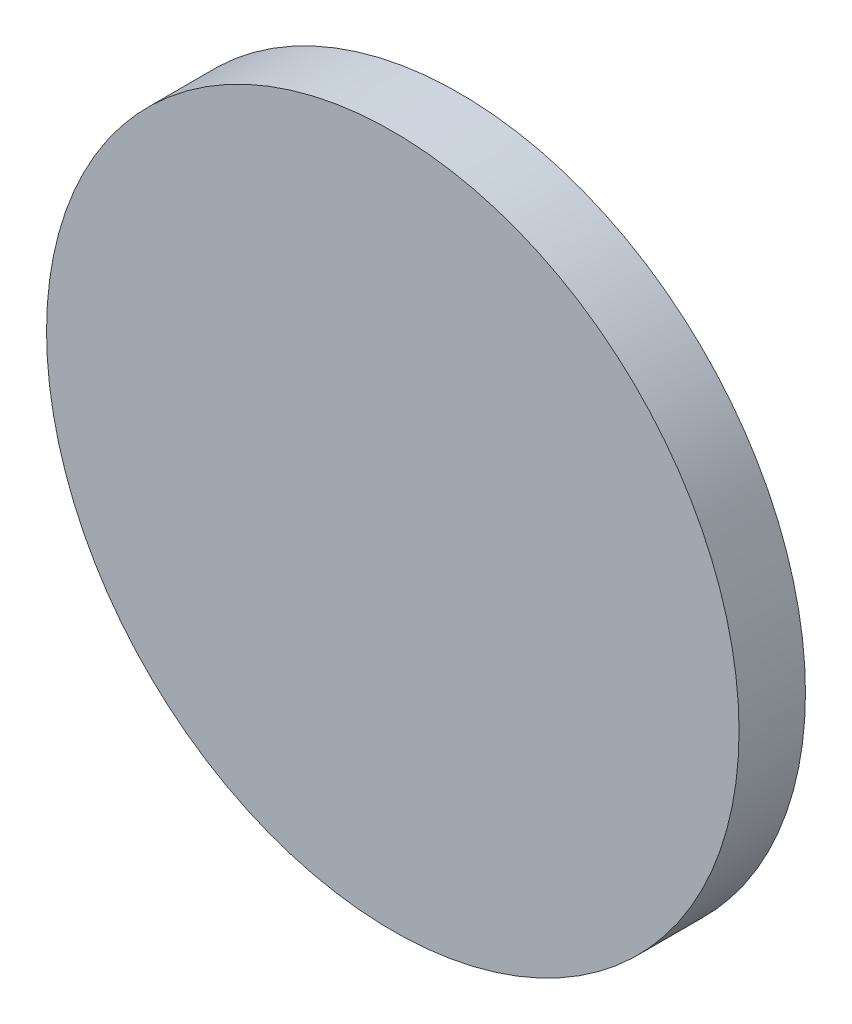
ISO-10303-21;
HEADER;
FILE_DESCRIPTION(('STEP AP214'),'2;1');
FILE_NAME('part.step','',(''),(''),'','','');
FILE_SCHEMA(('AUTOMOTIVE_DESIGN { 1 0 10303 214 1 1 1 1 }'));
ENDSEC;
DATA;
#1=APPLICATION_CONTEXT('core data for automotive mechanical design processes');
#2=APPLICATION_PROTOCOL_DEFINITION('international standard','automotive_design',2000,#1);
#3=PRODUCT_CONTEXT('',#1,'mechanical');
#4=PRODUCT('Part','Part','',(#3));
#5=PRODUCT_RELATED_PRODUCT_CATEGORY('part','',(#4));
#6=PRODUCT_DEFINITION_FORMATION('','',#4);
#7=PRODUCT_DEFINITION_CONTEXT('part definition',#1,'design');
#8=PRODUCT_DEFINITION('design','',#6,#7);
#9=PRODUCT_DEFINITION_SHAPE('','',#8);
#10=(LENGTH_UNIT() NAMED_UNIT(*) SI_UNIT(.MILLI.,.METRE.));
#11=(NAMED_UNIT(*) PLANE_ANGLE_UNIT() SI_UNIT($,.RADIAN.));
#12=(NAMED_UNIT(*) SI_UNIT($,.STERADIAN.) SOLID_ANGLE_UNIT());
#13=UNCERTAINTY_MEASURE_WITH_UNIT(LENGTH_MEASURE(1.E-05),#10,'distance_accuracy_value','');
#14=(GEOMETRIC_REPRESENTATION_CONTEXT(3) GLOBAL_UNCERTAINTY_ASSIGNED_CONTEXT((#13)) GLOBAL_UNIT_ASSIGNED_CONTEXT((#10,
#11,#12)) REPRESENTATION_CONTEXT('',''));
#15=CARTESIAN_POINT('',(0.,0.,0.));
#16=DIRECTION('',(0.,0.,1.));
#17=DIRECTION('',(1.,0.,0.));
#18=AXIS2_PLACEMENT_3D('',#15,#16,#17);
#19=CARTESIAN_POINT('',(0.,0.,35.));
#20=DIRECTION('',(0.,0.,-1.));
#21=DIRECTION('',(-1.,0.,0.));
#22=AXIS2_PLACEMENT_3D('',#19,#20,#21);
#23=CYLINDRICAL_SURFACE('',#22,182.5);
#24=CARTESIAN_POINT('',(0.,0.,35.));
#25=DIRECTION('',(0.,0.,1.));
#26=DIRECTION('',(1.,0.,0.));
#27=AXIS2_PLACEMENT_3D('',#24,#25,#26);
#28=CIRCLE('',#27,182.5);
#29=CARTESIAN_POINT('',(182.5,0.,35.));
#30=VERTEX_POINT('',#29);
#31=EDGE_CURVE('E10',#30,#30,#28,.T.);
#32=ORIENTED_EDGE('',*,*,#31,.F.);
#33=EDGE_LOOP('',(#32));
#34=FACE_BOUND('',#33,.T.);
#35=CARTESIAN_POINT('',(0.,0.,0.));
#36=DIRECTION('',(0.,0.,1.));
#37=DIRECTION('',(1.,0.,0.));
#38=AXIS2_PLACEMENT_3D('',#35,#36,#37);
#39=CIRCLE('',#38,182.5);
#40=CARTESIAN_POINT('',(182.5,0.,0.));
#41=VERTEX_POINT('',#40);
#42=EDGE_CURVE('E36',#41,#41,#39,.T.);
#43=ORIENTED_EDGE('',*,*,#42,.T.);
#44=EDGE_LOOP('',(#43));
#45=FACE_BOUND('',#44,.T.);
#46=ADVANCED_FACE('F33',(#34,#45),#23,.T.);
#47=CARTESIAN_POINT('',(0.,0.,35.));
#48=DIRECTION('',(0.,0.,1.));
#49=DIRECTION('',(1.,0.,0.));
#50=AXIS2_PLACEMENT_3D('',#47,#48,#49);
#51=PLANE('',#50);
#52=ORIENTED_EDGE('',*,*,#31,.T.);
#53=EDGE_LOOP('',(#52));
#54=FACE_BOUND('',#53,.T.);
#55=ADVANCED_FACE('F48',(#54),#51,.T.);
#56=CARTESIAN_POINT('',(0.,0.,0.));
#57=DIRECTION('',(0.,0.,1.));
#58=DIRECTION('',(1.,0.,0.));
#59=AXIS2_PLACEMENT_3D('',#56,#57,#58);
#60=PLANE('',#59);
#61=ORIENTED_EDGE('',*,*,#42,.F.);
#62=EDGE_LOOP('',(#61));
#63=FACE_BOUND('',#62,.T.);
#64=ADVANCED_FACE('F46',(#63),#60,.F.);
#65=CLOSED_SHELL('',(#46,#55,#64));
#66=MANIFOLD_SOLID_BREP('B2',#65);
#67=ADVANCED_BREP_SHAPE_REPRESENTATION('',(#18,#66),#14);
#68=SHAPE_DEFINITION_REPRESENTATION(#9,#67);
ENDSEC;
END-ISO-10303-21;
